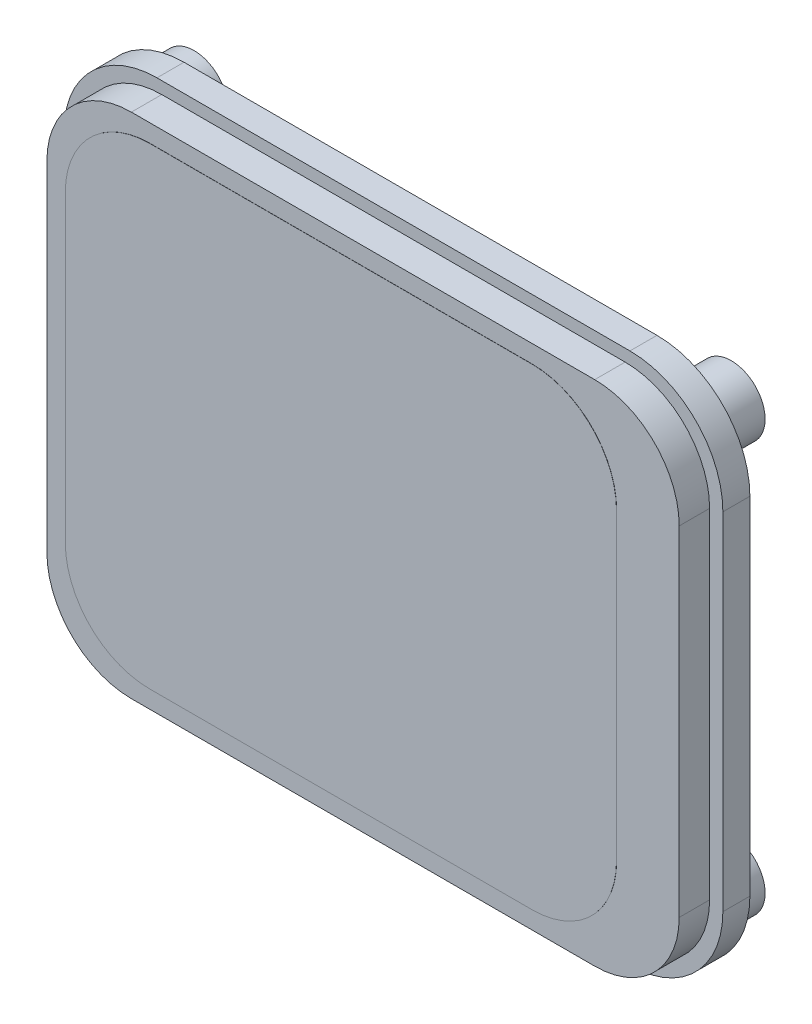
ISO-10303-21;
HEADER;
FILE_DESCRIPTION(('STEP AP214'),'2;1');
FILE_NAME('part.step','',(''),(''),'','','');
FILE_SCHEMA(('AUTOMOTIVE_DESIGN { 1 0 10303 214 1 1 1 1 }'));
ENDSEC;
DATA;
#1=APPLICATION_CONTEXT('core data for automotive mechanical design processes');
#2=APPLICATION_PROTOCOL_DEFINITION('international standard','automotive_design',2000,#1);
#3=PRODUCT_CONTEXT('',#1,'mechanical');
#4=PRODUCT('Part','Part','',(#3));
#5=PRODUCT_RELATED_PRODUCT_CATEGORY('part','',(#4));
#6=PRODUCT_DEFINITION_FORMATION('','',#4);
#7=PRODUCT_DEFINITION_CONTEXT('part definition',#1,'design');
#8=PRODUCT_DEFINITION('design','',#6,#7);
#9=PRODUCT_DEFINITION_SHAPE('','',#8);
#10=(LENGTH_UNIT() NAMED_UNIT(*) SI_UNIT(.MILLI.,.METRE.));
#11=(NAMED_UNIT(*) PLANE_ANGLE_UNIT() SI_UNIT($,.RADIAN.));
#12=(NAMED_UNIT(*) SI_UNIT($,.STERADIAN.) SOLID_ANGLE_UNIT());
#13=UNCERTAINTY_MEASURE_WITH_UNIT(LENGTH_MEASURE(1.E-05),#10,'distance_accuracy_value','');
#14=(GEOMETRIC_REPRESENTATION_CONTEXT(3) GLOBAL_UNCERTAINTY_ASSIGNED_CONTEXT((#13)) GLOBAL_UNIT_ASSIGNED_CONTEXT((#10,
#11,#12)) REPRESENTATION_CONTEXT('',''));
#15=CARTESIAN_POINT('',(0.,0.,0.));
#16=DIRECTION('',(0.,0.,1.));
#17=DIRECTION('',(1.,0.,0.));
#18=AXIS2_PLACEMENT_3D('',#15,#16,#17);
#19=CARTESIAN_POINT('',(11.315,8.985,-0.01));
#20=DIRECTION('',(0.,0.,1.));
#21=DIRECTION('',(1.,0.,0.));
#22=AXIS2_PLACEMENT_3D('',#19,#20,#21);
#23=CYLINDRICAL_SURFACE('',#22,5.);
#24=CARTESIAN_POINT('',(11.315,8.985,0.));
#25=DIRECTION('',(0.,0.,1.));
#26=DIRECTION('',(-1.,0.,0.));
#27=AXIS2_PLACEMENT_3D('',#24,#25,#26);
#28=CIRCLE('',#27,5.);
#29=CARTESIAN_POINT('',(16.315,8.98499999999997,0.));
#30=VERTEX_POINT('',#29);
#31=CARTESIAN_POINT('',(11.315,13.985,0.));
#32=VERTEX_POINT('',#31);
#33=EDGE_CURVE('E260',#30,#32,#28,.T.);
#34=ORIENTED_EDGE('',*,*,#33,.F.);
#35=DIRECTION('',(0.,0.,1.));
#36=VECTOR('',#35,1.);
#37=CARTESIAN_POINT('',(16.315,8.98499999999997,-0.01));
#38=LINE('',#37,#36);
#39=CARTESIAN_POINT('',(16.315,8.98499999999997,-0.01));
#40=VERTEX_POINT('',#39);
#41=EDGE_CURVE('E92',#40,#30,#38,.T.);
#42=ORIENTED_EDGE('',*,*,#41,.F.);
#43=CARTESIAN_POINT('',(11.315,8.985,-0.01));
#44=DIRECTION('',(0.,0.,1.));
#45=DIRECTION('',(-1.,0.,0.));
#46=AXIS2_PLACEMENT_3D('',#43,#44,#45);
#47=CIRCLE('',#46,5.);
#48=CARTESIAN_POINT('',(11.315,13.985,-0.01));
#49=VERTEX_POINT('',#48);
#50=EDGE_CURVE('E107',#40,#49,#47,.T.);
#51=ORIENTED_EDGE('',*,*,#50,.T.);
#52=DIRECTION('',(0.,0.,1.));
#53=VECTOR('',#52,1.);
#54=CARTESIAN_POINT('',(11.315,13.985,-0.01));
#55=LINE('',#54,#53);
#56=EDGE_CURVE('E125',#49,#32,#55,.T.);
#57=ORIENTED_EDGE('',*,*,#56,.T.);
#58=EDGE_LOOP('',(#34,#42,#51,#57));
#59=FACE_BOUND('',#58,.T.);
#60=ADVANCED_FACE('F35',(#59),#23,.T.);
#61=CARTESIAN_POINT('',(16.315,-8.98499999999996,-0.01));
#62=DIRECTION('',(1.,0.,0.));
#63=DIRECTION('',(0.,0.,-1.));
#64=AXIS2_PLACEMENT_3D('',#61,#62,#63);
#65=PLANE('',#64);
#66=DIRECTION('',(0.,1.,0.));
#67=VECTOR('',#66,1.);
#68=CARTESIAN_POINT('',(16.315,-8.98499999999996,0.));
#69=LINE('',#68,#67);
#70=CARTESIAN_POINT('',(16.315,-8.98499999999999,0.));
#71=VERTEX_POINT('',#70);
#72=EDGE_CURVE('E99',#71,#30,#69,.T.);
#73=ORIENTED_EDGE('',*,*,#72,.F.);
#74=DIRECTION('',(0.,0.,1.));
#75=VECTOR('',#74,1.);
#76=CARTESIAN_POINT('',(16.315,-8.98499999999999,-0.01));
#77=LINE('',#76,#75);
#78=CARTESIAN_POINT('',(16.315,-8.98499999999999,-0.01));
#79=VERTEX_POINT('',#78);
#80=EDGE_CURVE('E80',#79,#71,#77,.T.);
#81=ORIENTED_EDGE('',*,*,#80,.F.);
#82=DIRECTION('',(0.,1.,0.));
#83=VECTOR('',#82,1.);
#84=CARTESIAN_POINT('',(16.315,-8.98499999999996,-0.01));
#85=LINE('',#84,#83);
#86=EDGE_CURVE('E127',#79,#40,#85,.T.);
#87=ORIENTED_EDGE('',*,*,#86,.T.);
#88=ORIENTED_EDGE('',*,*,#41,.T.);
#89=EDGE_LOOP('',(#73,#81,#87,#88));
#90=FACE_BOUND('',#89,.T.);
#91=ADVANCED_FACE('F104',(#90),#65,.T.);
#92=CARTESIAN_POINT('',(11.315,-8.98499999999999,-0.01));
#93=DIRECTION('',(0.,0.,1.));
#94=DIRECTION('',(1.,0.,0.));
#95=AXIS2_PLACEMENT_3D('',#92,#93,#94);
#96=CYLINDRICAL_SURFACE('',#95,5.);
#97=CARTESIAN_POINT('',(11.315,-8.98499999999999,0.));
#98=DIRECTION('',(0.,0.,1.));
#99=DIRECTION('',(1.,0.,0.));
#100=AXIS2_PLACEMENT_3D('',#97,#98,#99);
#101=CIRCLE('',#100,5.);
#102=CARTESIAN_POINT('',(11.315,-13.985,0.));
#103=VERTEX_POINT('',#102);
#104=EDGE_CURVE('E84',#103,#71,#101,.T.);
#105=ORIENTED_EDGE('',*,*,#104,.F.);
#106=DIRECTION('',(0.,0.,1.));
#107=VECTOR('',#106,1.);
#108=CARTESIAN_POINT('',(11.315,-13.985,-0.01));
#109=LINE('',#108,#107);
#110=CARTESIAN_POINT('',(11.315,-13.985,-0.01));
#111=VERTEX_POINT('',#110);
#112=EDGE_CURVE('E93',#111,#103,#109,.T.);
#113=ORIENTED_EDGE('',*,*,#112,.F.);
#114=CARTESIAN_POINT('',(11.315,-8.98499999999999,-0.01));
#115=DIRECTION('',(0.,0.,1.));
#116=DIRECTION('',(1.,0.,0.));
#117=AXIS2_PLACEMENT_3D('',#114,#115,#116);
#118=CIRCLE('',#117,5.);
#119=EDGE_CURVE('E88',#111,#79,#118,.T.);
#120=ORIENTED_EDGE('',*,*,#119,.T.);
#121=ORIENTED_EDGE('',*,*,#80,.T.);
#122=EDGE_LOOP('',(#105,#113,#120,#121));
#123=FACE_BOUND('',#122,.T.);
#124=ADVANCED_FACE('F82',(#123),#96,.T.);
#125=CARTESIAN_POINT('',(-11.315,-13.985,-0.01));
#126=DIRECTION('',(0.,-1.,0.));
#127=DIRECTION('',(0.,0.,-1.));
#128=AXIS2_PLACEMENT_3D('',#125,#126,#127);
#129=PLANE('',#128);
#130=DIRECTION('',(1.,0.,0.));
#131=VECTOR('',#130,1.);
#132=CARTESIAN_POINT('',(-11.315,-13.985,0.));
#133=LINE('',#132,#131);
#134=CARTESIAN_POINT('',(-11.315,-13.985,0.));
#135=VERTEX_POINT('',#134);
#136=EDGE_CURVE('E102',#135,#103,#133,.T.);
#137=ORIENTED_EDGE('',*,*,#136,.F.);
#138=DIRECTION('',(0.,0.,1.));
#139=VECTOR('',#138,1.);
#140=CARTESIAN_POINT('',(-11.315,-13.985,-0.01));
#141=LINE('',#140,#139);
#142=CARTESIAN_POINT('',(-11.315,-13.985,-0.01));
#143=VERTEX_POINT('',#142);
#144=EDGE_CURVE('E117',#143,#135,#141,.T.);
#145=ORIENTED_EDGE('',*,*,#144,.F.);
#146=DIRECTION('',(1.,0.,0.));
#147=VECTOR('',#146,1.);
#148=CARTESIAN_POINT('',(-11.315,-13.985,-0.01));
#149=LINE('',#148,#147);
#150=EDGE_CURVE('E271',#143,#111,#149,.T.);
#151=ORIENTED_EDGE('',*,*,#150,.T.);
#152=ORIENTED_EDGE('',*,*,#112,.T.);
#153=EDGE_LOOP('',(#137,#145,#151,#152));
#154=FACE_BOUND('',#153,.T.);
#155=ADVANCED_FACE('F297',(#154),#129,.T.);
#156=CARTESIAN_POINT('',(-11.315,-8.98499999999999,-0.01));
#157=DIRECTION('',(0.,0.,1.));
#158=DIRECTION('',(1.,0.,0.));
#159=AXIS2_PLACEMENT_3D('',#156,#157,#158);
#160=CYLINDRICAL_SURFACE('',#159,5.);
#161=CARTESIAN_POINT('',(-11.315,-8.98499999999999,0.));
#162=DIRECTION('',(0.,0.,1.));
#163=DIRECTION('',(-1.,0.,0.));
#164=AXIS2_PLACEMENT_3D('',#161,#162,#163);
#165=CIRCLE('',#164,5.);
#166=CARTESIAN_POINT('',(-16.315,-8.98499999999996,0.));
#167=VERTEX_POINT('',#166);
#168=EDGE_CURVE('E286',#167,#135,#165,.T.);
#169=ORIENTED_EDGE('',*,*,#168,.F.);
#170=DIRECTION('',(0.,0.,1.));
#171=VECTOR('',#170,1.);
#172=CARTESIAN_POINT('',(-16.315,-8.98499999999996,-0.01));
#173=LINE('',#172,#171);
#174=CARTESIAN_POINT('',(-16.315,-8.98499999999996,-0.01));
#175=VERTEX_POINT('',#174);
#176=EDGE_CURVE('E119',#175,#167,#173,.T.);
#177=ORIENTED_EDGE('',*,*,#176,.F.);
#178=CARTESIAN_POINT('',(-11.315,-8.98499999999999,-0.01));
#179=DIRECTION('',(0.,0.,1.));
#180=DIRECTION('',(-1.,0.,0.));
#181=AXIS2_PLACEMENT_3D('',#178,#179,#180);
#182=CIRCLE('',#181,5.);
#183=EDGE_CURVE('E268',#175,#143,#182,.T.);
#184=ORIENTED_EDGE('',*,*,#183,.T.);
#185=ORIENTED_EDGE('',*,*,#144,.T.);
#186=EDGE_LOOP('',(#169,#177,#184,#185));
#187=FACE_BOUND('',#186,.T.);
#188=ADVANCED_FACE('F291',(#187),#160,.T.);
#189=CARTESIAN_POINT('',(-16.315,-8.98499999999996,-0.01));
#190=DIRECTION('',(-1.,0.,0.));
#191=DIRECTION('',(0.,0.,1.));
#192=AXIS2_PLACEMENT_3D('',#189,#190,#191);
#193=PLANE('',#192);
#194=DIRECTION('',(0.,-1.,0.));
#195=VECTOR('',#194,1.);
#196=CARTESIAN_POINT('',(-16.315,-8.98499999999996,0.));
#197=LINE('',#196,#195);
#198=CARTESIAN_POINT('',(-16.315,8.98499999999997,0.));
#199=VERTEX_POINT('',#198);
#200=EDGE_CURVE('E283',#199,#167,#197,.T.);
#201=ORIENTED_EDGE('',*,*,#200,.F.);
#202=DIRECTION('',(0.,0.,1.));
#203=VECTOR('',#202,1.);
#204=CARTESIAN_POINT('',(-16.315,8.98499999999997,-0.01));
#205=LINE('',#204,#203);
#206=CARTESIAN_POINT('',(-16.315,8.98499999999997,-0.01));
#207=VERTEX_POINT('',#206);
#208=EDGE_CURVE('E121',#207,#199,#205,.T.);
#209=ORIENTED_EDGE('',*,*,#208,.F.);
#210=DIRECTION('',(0.,-1.,0.));
#211=VECTOR('',#210,1.);
#212=CARTESIAN_POINT('',(-16.315,-8.98499999999996,-0.01));
#213=LINE('',#212,#211);
#214=EDGE_CURVE('E265',#207,#175,#213,.T.);
#215=ORIENTED_EDGE('',*,*,#214,.T.);
#216=ORIENTED_EDGE('',*,*,#176,.T.);
#217=EDGE_LOOP('',(#201,#209,#215,#216));
#218=FACE_BOUND('',#217,.T.);
#219=ADVANCED_FACE('F527',(#218),#193,.T.);
#220=CARTESIAN_POINT('',(-11.315,8.985,-0.01));
#221=DIRECTION('',(0.,0.,1.));
#222=DIRECTION('',(1.,0.,0.));
#223=AXIS2_PLACEMENT_3D('',#220,#221,#222);
#224=CYLINDRICAL_SURFACE('',#223,5.);
#225=CARTESIAN_POINT('',(-11.315,8.985,0.));
#226=DIRECTION('',(0.,0.,1.));
#227=DIRECTION('',(-1.,0.,0.));
#228=AXIS2_PLACEMENT_3D('',#225,#226,#227);
#229=CIRCLE('',#228,5.);
#230=CARTESIAN_POINT('',(-11.315,13.985,0.));
#231=VERTEX_POINT('',#230);
#232=EDGE_CURVE('E280',#231,#199,#229,.T.);
#233=ORIENTED_EDGE('',*,*,#232,.F.);
#234=DIRECTION('',(0.,0.,1.));
#235=VECTOR('',#234,1.);
#236=CARTESIAN_POINT('',(-11.315,13.985,-0.01));
#237=LINE('',#236,#235);
#238=CARTESIAN_POINT('',(-11.315,13.985,-0.01));
#239=VERTEX_POINT('',#238);
#240=EDGE_CURVE('E123',#239,#231,#237,.T.);
#241=ORIENTED_EDGE('',*,*,#240,.F.);
#242=CARTESIAN_POINT('',(-11.315,8.985,-0.01));
#243=DIRECTION('',(0.,0.,1.));
#244=DIRECTION('',(-1.,0.,0.));
#245=AXIS2_PLACEMENT_3D('',#242,#243,#244);
#246=CIRCLE('',#245,5.);
#247=EDGE_CURVE('E50',#239,#207,#246,.T.);
#248=ORIENTED_EDGE('',*,*,#247,.T.);
#249=ORIENTED_EDGE('',*,*,#208,.T.);
#250=EDGE_LOOP('',(#233,#241,#248,#249));
#251=FACE_BOUND('',#250,.T.);
#252=ADVANCED_FACE('F524',(#251),#224,.T.);
#253=CARTESIAN_POINT('',(-11.315,13.985,-0.01));
#254=DIRECTION('',(0.,1.,0.));
#255=DIRECTION('',(0.,0.,1.));
#256=AXIS2_PLACEMENT_3D('',#253,#254,#255);
#257=PLANE('',#256);
#258=DIRECTION('',(-1.,0.,0.));
#259=VECTOR('',#258,1.);
#260=CARTESIAN_POINT('',(-11.315,13.985,0.));
#261=LINE('',#260,#259);
#262=EDGE_CURVE('E277',#32,#231,#261,.T.);
#263=ORIENTED_EDGE('',*,*,#262,.F.);
#264=ORIENTED_EDGE('',*,*,#56,.F.);
#265=DIRECTION('',(-1.,0.,0.));
#266=VECTOR('',#265,1.);
#267=CARTESIAN_POINT('',(-11.315,13.985,-0.01));
#268=LINE('',#267,#266);
#269=EDGE_CURVE('E110',#49,#239,#268,.T.);
#270=ORIENTED_EDGE('',*,*,#269,.T.);
#271=ORIENTED_EDGE('',*,*,#240,.T.);
#272=EDGE_LOOP('',(#263,#264,#270,#271));
#273=FACE_BOUND('',#272,.T.);
#274=ADVANCED_FACE('F522',(#273),#257,.T.);
#275=CARTESIAN_POINT('',(11.315,8.985,0.));
#276=DIRECTION('',(0.,0.,-1.));
#277=DIRECTION('',(-1.,0.,0.));
#278=AXIS2_PLACEMENT_3D('',#275,#276,#277);
#279=PLANE('',#278);
#280=ORIENTED_EDGE('',*,*,#33,.T.);
#281=ORIENTED_EDGE('',*,*,#262,.T.);
#282=ORIENTED_EDGE('',*,*,#232,.T.);
#283=ORIENTED_EDGE('',*,*,#200,.T.);
#284=ORIENTED_EDGE('',*,*,#168,.T.);
#285=ORIENTED_EDGE('',*,*,#136,.T.);
#286=ORIENTED_EDGE('',*,*,#104,.T.);
#287=ORIENTED_EDGE('',*,*,#72,.T.);
#288=EDGE_LOOP('',(#280,#281,#282,#283,#284,#285,#286,#287));
#289=FACE_BOUND('',#288,.T.);
#290=ADVANCED_FACE('F98',(#289),#279,.F.);
#291=CARTESIAN_POINT('',(-12.415,-10.035,-1.81));
#292=DIRECTION('',(0.,0.,1.));
#293=DIRECTION('',(1.,0.,0.));
#294=AXIS2_PLACEMENT_3D('',#291,#292,#293);
#295=CYLINDRICAL_SURFACE('',#294,5.);
#296=CARTESIAN_POINT('',(-12.415,-10.035,-0.01));
#297=DIRECTION('',(0.,0.,-1.));
#298=DIRECTION('',(-1.,0.,0.));
#299=AXIS2_PLACEMENT_3D('',#296,#297,#298);
#300=CIRCLE('',#299,5.);
#301=CARTESIAN_POINT('',(-12.415,-15.035,-0.01));
#302=VERTEX_POINT('',#301);
#303=CARTESIAN_POINT('',(-17.415,-10.035,-0.01));
#304=VERTEX_POINT('',#303);
#305=EDGE_CURVE('E182',#302,#304,#300,.T.);
#306=ORIENTED_EDGE('',*,*,#305,.T.);
#307=DIRECTION('',(0.,0.,1.));
#308=VECTOR('',#307,1.);
#309=CARTESIAN_POINT('',(-17.415,-10.035,-1.81));
#310=LINE('',#309,#308);
#311=CARTESIAN_POINT('',(-17.415,-10.035,-1.81));
#312=VERTEX_POINT('',#311);
#313=EDGE_CURVE('E258',#312,#304,#310,.T.);
#314=ORIENTED_EDGE('',*,*,#313,.F.);
#315=CARTESIAN_POINT('',(-12.415,-10.035,-1.81));
#316=DIRECTION('',(0.,0.,-1.));
#317=DIRECTION('',(-1.,0.,0.));
#318=AXIS2_PLACEMENT_3D('',#315,#316,#317);
#319=CIRCLE('',#318,5.);
#320=CARTESIAN_POINT('',(-12.415,-15.035,-1.81));
#321=VERTEX_POINT('',#320);
#322=EDGE_CURVE('E193',#321,#312,#319,.T.);
#323=ORIENTED_EDGE('',*,*,#322,.F.);
#324=DIRECTION('',(0.,0.,1.));
#325=VECTOR('',#324,1.);
#326=CARTESIAN_POINT('',(-12.415,-15.035,-1.81));
#327=LINE('',#326,#325);
#328=EDGE_CURVE('E217',#321,#302,#327,.T.);
#329=ORIENTED_EDGE('',*,*,#328,.T.);
#330=EDGE_LOOP('',(#306,#314,#323,#329));
#331=FACE_BOUND('',#330,.T.);
#332=ADVANCED_FACE('F540',(#331),#295,.T.);
#333=CARTESIAN_POINT('',(-17.415,-10.035,-1.81));
#334=DIRECTION('',(1.,0.,0.));
#335=DIRECTION('',(0.,0.,-1.));
#336=AXIS2_PLACEMENT_3D('',#333,#334,#335);
#337=PLANE('',#336);
#338=DIRECTION('',(0.,1.,0.));
#339=VECTOR('',#338,1.);
#340=CARTESIAN_POINT('',(-17.415,-10.035,-0.01));
#341=LINE('',#340,#339);
#342=CARTESIAN_POINT('',(-17.415,10.035,-0.01));
#343=VERTEX_POINT('',#342);
#344=EDGE_CURVE('E186',#304,#343,#341,.T.);
#345=ORIENTED_EDGE('',*,*,#344,.T.);
#346=DIRECTION('',(0.,0.,1.));
#347=VECTOR('',#346,1.);
#348=CARTESIAN_POINT('',(-17.415,10.035,-1.81));
#349=LINE('',#348,#347);
#350=CARTESIAN_POINT('',(-17.415,10.035,-1.81));
#351=VERTEX_POINT('',#350);
#352=EDGE_CURVE('E255',#351,#343,#349,.T.);
#353=ORIENTED_EDGE('',*,*,#352,.F.);
#354=DIRECTION('',(0.,1.,0.));
#355=VECTOR('',#354,1.);
#356=CARTESIAN_POINT('',(-17.415,-10.035,-1.81));
#357=LINE('',#356,#355);
#358=EDGE_CURVE('E196',#312,#351,#357,.T.);
#359=ORIENTED_EDGE('',*,*,#358,.F.);
#360=ORIENTED_EDGE('',*,*,#313,.T.);
#361=EDGE_LOOP('',(#345,#353,#359,#360));
#362=FACE_BOUND('',#361,.T.);
#363=ADVANCED_FACE('F564',(#362),#337,.F.);
#364=CARTESIAN_POINT('',(-12.415,10.035,-1.81));
#365=DIRECTION('',(0.,0.,1.));
#366=DIRECTION('',(1.,0.,0.));
#367=AXIS2_PLACEMENT_3D('',#364,#365,#366);
#368=CYLINDRICAL_SURFACE('',#367,5.);
#369=CARTESIAN_POINT('',(-12.415,10.035,-0.01));
#370=DIRECTION('',(0.,0.,-1.));
#371=DIRECTION('',(1.,0.,0.));
#372=AXIS2_PLACEMENT_3D('',#369,#370,#371);
#373=CIRCLE('',#372,5.);
#374=CARTESIAN_POINT('',(-12.415,15.035,-0.01));
#375=VERTEX_POINT('',#374);
#376=EDGE_CURVE('E221',#343,#375,#373,.T.);
#377=ORIENTED_EDGE('',*,*,#376,.T.);
#378=DIRECTION('',(0.,0.,1.));
#379=VECTOR('',#378,1.);
#380=CARTESIAN_POINT('',(-12.415,15.035,-1.81));
#381=LINE('',#380,#379);
#382=CARTESIAN_POINT('',(-12.415,15.035,-1.81));
#383=VERTEX_POINT('',#382);
#384=EDGE_CURVE('E252',#383,#375,#381,.T.);
#385=ORIENTED_EDGE('',*,*,#384,.F.);
#386=CARTESIAN_POINT('',(-12.415,10.035,-1.81));
#387=DIRECTION('',(0.,0.,-1.));
#388=DIRECTION('',(1.,0.,0.));
#389=AXIS2_PLACEMENT_3D('',#386,#387,#388);
#390=CIRCLE('',#389,5.);
#391=EDGE_CURVE('E200',#351,#383,#390,.T.);
#392=ORIENTED_EDGE('',*,*,#391,.F.);
#393=ORIENTED_EDGE('',*,*,#352,.T.);
#394=EDGE_LOOP('',(#377,#385,#392,#393));
#395=FACE_BOUND('',#394,.T.);
#396=ADVANCED_FACE('F561',(#395),#368,.T.);
#397=CARTESIAN_POINT('',(15.015,15.035,-1.81));
#398=DIRECTION('',(0.,-1.,0.));
#399=DIRECTION('',(0.,0.,-1.));
#400=AXIS2_PLACEMENT_3D('',#397,#398,#399);
#401=PLANE('',#400);
#402=DIRECTION('',(1.,0.,0.));
#403=VECTOR('',#402,1.);
#404=CARTESIAN_POINT('',(15.015,15.035,-0.01));
#405=LINE('',#404,#403);
#406=CARTESIAN_POINT('',(15.015,15.035,-0.01));
#407=VERTEX_POINT('',#406);
#408=EDGE_CURVE('E224',#375,#407,#405,.T.);
#409=ORIENTED_EDGE('',*,*,#408,.T.);
#410=DIRECTION('',(0.,0.,1.));
#411=VECTOR('',#410,1.);
#412=CARTESIAN_POINT('',(15.015,15.035,-1.81));
#413=LINE('',#412,#411);
#414=CARTESIAN_POINT('',(15.015,15.035,-1.81));
#415=VERTEX_POINT('',#414);
#416=EDGE_CURVE('E249',#415,#407,#413,.T.);
#417=ORIENTED_EDGE('',*,*,#416,.F.);
#418=DIRECTION('',(1.,0.,0.));
#419=VECTOR('',#418,1.);
#420=CARTESIAN_POINT('',(15.015,15.035,-1.81));
#421=LINE('',#420,#419);
#422=EDGE_CURVE('E203',#383,#415,#421,.T.);
#423=ORIENTED_EDGE('',*,*,#422,.F.);
#424=ORIENTED_EDGE('',*,*,#384,.T.);
#425=EDGE_LOOP('',(#409,#417,#423,#424));
#426=FACE_BOUND('',#425,.T.);
#427=ADVANCED_FACE('F559',(#426),#401,.F.);
#428=CARTESIAN_POINT('',(15.015,10.035,-1.81));
#429=DIRECTION('',(0.,0.,1.));
#430=DIRECTION('',(1.,0.,0.));
#431=AXIS2_PLACEMENT_3D('',#428,#429,#430);
#432=CYLINDRICAL_SURFACE('',#431,5.);
#433=CARTESIAN_POINT('',(15.015,10.035,-0.01));
#434=DIRECTION('',(0.,0.,-1.));
#435=DIRECTION('',(1.,0.,0.));
#436=AXIS2_PLACEMENT_3D('',#433,#434,#435);
#437=CIRCLE('',#436,5.);
#438=CARTESIAN_POINT('',(20.015,10.035,-0.01));
#439=VERTEX_POINT('',#438);
#440=EDGE_CURVE('E227',#407,#439,#437,.T.);
#441=ORIENTED_EDGE('',*,*,#440,.T.);
#442=DIRECTION('',(0.,0.,1.));
#443=VECTOR('',#442,1.);
#444=CARTESIAN_POINT('',(20.015,10.035,-1.81));
#445=LINE('',#444,#443);
#446=CARTESIAN_POINT('',(20.015,10.035,-1.81));
#447=VERTEX_POINT('',#446);
#448=EDGE_CURVE('E246',#447,#439,#445,.T.);
#449=ORIENTED_EDGE('',*,*,#448,.F.);
#450=CARTESIAN_POINT('',(15.015,10.035,-1.81));
#451=DIRECTION('',(0.,0.,-1.));
#452=DIRECTION('',(1.,0.,0.));
#453=AXIS2_PLACEMENT_3D('',#450,#451,#452);
#454=CIRCLE('',#453,5.);
#455=EDGE_CURVE('E206',#415,#447,#454,.T.);
#456=ORIENTED_EDGE('',*,*,#455,.F.);
#457=ORIENTED_EDGE('',*,*,#416,.T.);
#458=EDGE_LOOP('',(#441,#449,#456,#457));
#459=FACE_BOUND('',#458,.T.);
#460=ADVANCED_FACE('F556',(#459),#432,.T.);
#461=CARTESIAN_POINT('',(20.015,-10.035,-1.81));
#462=DIRECTION('',(-1.,0.,0.));
#463=DIRECTION('',(0.,0.,1.));
#464=AXIS2_PLACEMENT_3D('',#461,#462,#463);
#465=PLANE('',#464);
#466=DIRECTION('',(0.,-1.,0.));
#467=VECTOR('',#466,1.);
#468=CARTESIAN_POINT('',(20.015,-10.035,-0.01));
#469=LINE('',#468,#467);
#470=CARTESIAN_POINT('',(20.015,-10.035,-0.01));
#471=VERTEX_POINT('',#470);
#472=EDGE_CURVE('E230',#439,#471,#469,.T.);
#473=ORIENTED_EDGE('',*,*,#472,.T.);
#474=DIRECTION('',(0.,0.,1.));
#475=VECTOR('',#474,1.);
#476=CARTESIAN_POINT('',(20.015,-10.035,-1.81));
#477=LINE('',#476,#475);
#478=CARTESIAN_POINT('',(20.015,-10.035,-1.81));
#479=VERTEX_POINT('',#478);
#480=EDGE_CURVE('E243',#479,#471,#477,.T.);
#481=ORIENTED_EDGE('',*,*,#480,.F.);
#482=DIRECTION('',(0.,-1.,0.));
#483=VECTOR('',#482,1.);
#484=CARTESIAN_POINT('',(20.015,-10.035,-1.81));
#485=LINE('',#484,#483);
#486=EDGE_CURVE('E209',#447,#479,#485,.T.);
#487=ORIENTED_EDGE('',*,*,#486,.F.);
#488=ORIENTED_EDGE('',*,*,#448,.T.);
#489=EDGE_LOOP('',(#473,#481,#487,#488));
#490=FACE_BOUND('',#489,.T.);
#491=ADVANCED_FACE('F553',(#490),#465,.F.);
#492=CARTESIAN_POINT('',(15.015,-10.035,-1.81));
#493=DIRECTION('',(0.,0.,1.));
#494=DIRECTION('',(1.,0.,0.));
#495=AXIS2_PLACEMENT_3D('',#492,#493,#494);
#496=CYLINDRICAL_SURFACE('',#495,5.);
#497=CARTESIAN_POINT('',(15.015,-10.035,-0.01));
#498=DIRECTION('',(0.,0.,-1.));
#499=DIRECTION('',(1.,0.,0.));
#500=AXIS2_PLACEMENT_3D('',#497,#498,#499);
#501=CIRCLE('',#500,5.);
#502=CARTESIAN_POINT('',(15.015,-15.035,-0.01));
#503=VERTEX_POINT('',#502);
#504=EDGE_CURVE('E233',#471,#503,#501,.T.);
#505=ORIENTED_EDGE('',*,*,#504,.T.);
#506=DIRECTION('',(0.,0.,1.));
#507=VECTOR('',#506,1.);
#508=CARTESIAN_POINT('',(15.015,-15.035,-1.81));
#509=LINE('',#508,#507);
#510=CARTESIAN_POINT('',(15.015,-15.035,-1.81));
#511=VERTEX_POINT('',#510);
#512=EDGE_CURVE('E240',#511,#503,#509,.T.);
#513=ORIENTED_EDGE('',*,*,#512,.F.);
#514=CARTESIAN_POINT('',(15.015,-10.035,-1.81));
#515=DIRECTION('',(0.,0.,-1.));
#516=DIRECTION('',(1.,0.,0.));
#517=AXIS2_PLACEMENT_3D('',#514,#515,#516);
#518=CIRCLE('',#517,5.);
#519=EDGE_CURVE('E212',#479,#511,#518,.T.);
#520=ORIENTED_EDGE('',*,*,#519,.F.);
#521=ORIENTED_EDGE('',*,*,#480,.T.);
#522=EDGE_LOOP('',(#505,#513,#520,#521));
#523=FACE_BOUND('',#522,.T.);
#524=ADVANCED_FACE('F548',(#523),#496,.T.);
#525=CARTESIAN_POINT('',(15.015,-15.035,-1.81));
#526=DIRECTION('',(0.,1.,0.));
#527=DIRECTION('',(0.,0.,1.));
#528=AXIS2_PLACEMENT_3D('',#525,#526,#527);
#529=PLANE('',#528);
#530=DIRECTION('',(-1.,0.,0.));
#531=VECTOR('',#530,1.);
#532=CARTESIAN_POINT('',(15.015,-15.035,-0.01));
#533=LINE('',#532,#531);
#534=EDGE_CURVE('E197',#503,#302,#533,.T.);
#535=ORIENTED_EDGE('',*,*,#534,.T.);
#536=ORIENTED_EDGE('',*,*,#328,.F.);
#537=DIRECTION('',(-1.,0.,0.));
#538=VECTOR('',#537,1.);
#539=CARTESIAN_POINT('',(15.015,-15.035,-1.81));
#540=LINE('',#539,#538);
#541=EDGE_CURVE('E215',#511,#321,#540,.T.);
#542=ORIENTED_EDGE('',*,*,#541,.F.);
#543=ORIENTED_EDGE('',*,*,#512,.T.);
#544=EDGE_LOOP('',(#535,#536,#542,#543));
#545=FACE_BOUND('',#544,.T.);
#546=ADVANCED_FACE('F532',(#545),#529,.F.);
#547=CARTESIAN_POINT('',(-12.415,-10.035,-0.01));
#548=DIRECTION('',(0.,0.,-1.));
#549=DIRECTION('',(-1.,0.,0.));
#550=AXIS2_PLACEMENT_3D('',#547,#548,#549);
#551=PLANE('',#550);
#552=ORIENTED_EDGE('',*,*,#50,.F.);
#553=ORIENTED_EDGE('',*,*,#86,.F.);
#554=ORIENTED_EDGE('',*,*,#119,.F.);
#555=ORIENTED_EDGE('',*,*,#150,.F.);
#556=ORIENTED_EDGE('',*,*,#183,.F.);
#557=ORIENTED_EDGE('',*,*,#214,.F.);
#558=ORIENTED_EDGE('',*,*,#247,.F.);
#559=ORIENTED_EDGE('',*,*,#269,.F.);
#560=EDGE_LOOP('',(#552,#553,#554,#555,#556,#557,#558,#559));
#561=FACE_BOUND('',#560,.T.);
#562=ORIENTED_EDGE('',*,*,#305,.F.);
#563=ORIENTED_EDGE('',*,*,#534,.F.);
#564=ORIENTED_EDGE('',*,*,#504,.F.);
#565=ORIENTED_EDGE('',*,*,#472,.F.);
#566=ORIENTED_EDGE('',*,*,#440,.F.);
#567=ORIENTED_EDGE('',*,*,#408,.F.);
#568=ORIENTED_EDGE('',*,*,#376,.F.);
#569=ORIENTED_EDGE('',*,*,#344,.F.);
#570=EDGE_LOOP('',(#562,#563,#564,#565,#566,#567,#568,#569));
#571=FACE_BOUND('',#570,.T.);
#572=ADVANCED_FACE('F529',(#561,#571),#551,.F.);
#573=CARTESIAN_POINT('',(-12.7,10.25,-3.41));
#574=DIRECTION('',(0.,0.,1.));
#575=DIRECTION('',(1.,0.,0.));
#576=AXIS2_PLACEMENT_3D('',#573,#574,#575);
#577=CYLINDRICAL_SURFACE('',#576,5.5);
#578=CARTESIAN_POINT('',(-12.7,10.25,-1.81));
#579=DIRECTION('',(0.,0.,-1.));
#580=DIRECTION('',(1.,0.,0.));
#581=AXIS2_PLACEMENT_3D('',#578,#579,#580);
#582=CIRCLE('',#581,5.5);
#583=CARTESIAN_POINT('',(-18.2,10.25,-1.81));
#584=VERTEX_POINT('',#583);
#585=CARTESIAN_POINT('',(-12.7,15.75,-1.81));
#586=VERTEX_POINT('',#585);
#587=EDGE_CURVE('E179',#584,#586,#582,.T.);
#588=ORIENTED_EDGE('',*,*,#587,.T.);
#589=DIRECTION('',(0.,0.,1.));
#590=VECTOR('',#589,1.);
#591=CARTESIAN_POINT('',(-12.7,15.75,-3.41));
#592=LINE('',#591,#590);
#593=CARTESIAN_POINT('',(-12.7,15.75,-3.41));
#594=VERTEX_POINT('',#593);
#595=EDGE_CURVE('E175',#594,#586,#592,.T.);
#596=ORIENTED_EDGE('',*,*,#595,.F.);
#597=CARTESIAN_POINT('',(-12.7,10.25,-3.41));
#598=DIRECTION('',(0.,0.,-1.));
#599=DIRECTION('',(1.,0.,0.));
#600=AXIS2_PLACEMENT_3D('',#597,#598,#599);
#601=CIRCLE('',#600,5.5);
#602=CARTESIAN_POINT('',(-18.2,10.25,-3.41));
#603=VERTEX_POINT('',#602);
#604=EDGE_CURVE('E155',#603,#594,#601,.T.);
#605=ORIENTED_EDGE('',*,*,#604,.F.);
#606=DIRECTION('',(0.,0.,1.));
#607=VECTOR('',#606,1.);
#608=CARTESIAN_POINT('',(-18.2,10.25,-3.41));
#609=LINE('',#608,#607);
#610=EDGE_CURVE('E413',#603,#584,#609,.T.);
#611=ORIENTED_EDGE('',*,*,#610,.T.);
#612=EDGE_LOOP('',(#588,#596,#605,#611));
#613=FACE_BOUND('',#612,.T.);
#614=ADVANCED_FACE('F176',(#613),#577,.T.);
#615=CARTESIAN_POINT('',(15.3,15.75,-3.41));
#616=DIRECTION('',(0.,-1.,0.));
#617=DIRECTION('',(0.,0.,-1.));
#618=AXIS2_PLACEMENT_3D('',#615,#616,#617);
#619=PLANE('',#618);
#620=DIRECTION('',(1.,0.,0.));
#621=VECTOR('',#620,1.);
#622=CARTESIAN_POINT('',(15.3,15.75,-1.81));
#623=LINE('',#622,#621);
#624=CARTESIAN_POINT('',(15.3,15.75,-1.81));
#625=VERTEX_POINT('',#624);
#626=EDGE_CURVE('E415',#586,#625,#623,.T.);
#627=ORIENTED_EDGE('',*,*,#626,.T.);
#628=DIRECTION('',(0.,0.,1.));
#629=VECTOR('',#628,1.);
#630=CARTESIAN_POINT('',(15.3,15.75,-3.41));
#631=LINE('',#630,#629);
#632=CARTESIAN_POINT('',(15.3,15.75,-3.41));
#633=VERTEX_POINT('',#632);
#634=EDGE_CURVE('E183',#633,#625,#631,.T.);
#635=ORIENTED_EDGE('',*,*,#634,.F.);
#636=DIRECTION('',(1.,0.,0.));
#637=VECTOR('',#636,1.);
#638=CARTESIAN_POINT('',(15.3,15.75,-3.41));
#639=LINE('',#638,#637);
#640=EDGE_CURVE('E160',#594,#633,#639,.T.);
#641=ORIENTED_EDGE('',*,*,#640,.F.);
#642=ORIENTED_EDGE('',*,*,#595,.T.);
#643=EDGE_LOOP('',(#627,#635,#641,#642));
#644=FACE_BOUND('',#643,.T.);
#645=ADVANCED_FACE('F455',(#644),#619,.F.);
#646=CARTESIAN_POINT('',(15.3,10.25,-3.41));
#647=DIRECTION('',(0.,0.,1.));
#648=DIRECTION('',(1.,0.,0.));
#649=AXIS2_PLACEMENT_3D('',#646,#647,#648);
#650=CYLINDRICAL_SURFACE('',#649,5.5);
#651=CARTESIAN_POINT('',(15.3,10.25,-1.81));
#652=DIRECTION('',(0.,0.,-1.));
#653=DIRECTION('',(1.,0.,0.));
#654=AXIS2_PLACEMENT_3D('',#651,#652,#653);
#655=CIRCLE('',#654,5.5);
#656=CARTESIAN_POINT('',(20.8,10.25,-1.81));
#657=VERTEX_POINT('',#656);
#658=EDGE_CURVE('E396',#625,#657,#655,.T.);
#659=ORIENTED_EDGE('',*,*,#658,.T.);
#660=DIRECTION('',(0.,0.,1.));
#661=VECTOR('',#660,1.);
#662=CARTESIAN_POINT('',(20.8,10.25,-3.41));
#663=LINE('',#662,#661);
#664=CARTESIAN_POINT('',(20.8,10.25,-3.41));
#665=VERTEX_POINT('',#664);
#666=EDGE_CURVE('E189',#665,#657,#663,.T.);
#667=ORIENTED_EDGE('',*,*,#666,.F.);
#668=CARTESIAN_POINT('',(15.3,10.25,-3.41));
#669=DIRECTION('',(0.,0.,-1.));
#670=DIRECTION('',(1.,0.,0.));
#671=AXIS2_PLACEMENT_3D('',#668,#669,#670);
#672=CIRCLE('',#671,5.5);
#673=EDGE_CURVE('E386',#633,#665,#672,.T.);
#674=ORIENTED_EDGE('',*,*,#673,.F.);
#675=ORIENTED_EDGE('',*,*,#634,.T.);
#676=EDGE_LOOP('',(#659,#667,#674,#675));
#677=FACE_BOUND('',#676,.T.);
#678=ADVANCED_FACE('F394',(#677),#650,.T.);
#679=CARTESIAN_POINT('',(20.8,-10.25,-3.41));
#680=DIRECTION('',(-1.,0.,0.));
#681=DIRECTION('',(0.,0.,1.));
#682=AXIS2_PLACEMENT_3D('',#679,#680,#681);
#683=PLANE('',#682);
#684=DIRECTION('',(0.,-1.,0.));
#685=VECTOR('',#684,1.);
#686=CARTESIAN_POINT('',(20.8,-10.25,-1.81));
#687=LINE('',#686,#685);
#688=CARTESIAN_POINT('',(20.8,-10.25,-1.81));
#689=VERTEX_POINT('',#688);
#690=EDGE_CURVE('E419',#657,#689,#687,.T.);
#691=ORIENTED_EDGE('',*,*,#690,.T.);
#692=DIRECTION('',(0.,0.,1.));
#693=VECTOR('',#692,1.);
#694=CARTESIAN_POINT('',(20.8,-10.25,-3.41));
#695=LINE('',#694,#693);
#696=CARTESIAN_POINT('',(20.8,-10.25,-3.41));
#697=VERTEX_POINT('',#696);
#698=EDGE_CURVE('E399',#697,#689,#695,.T.);
#699=ORIENTED_EDGE('',*,*,#698,.F.);
#700=DIRECTION('',(0.,-1.,0.));
#701=VECTOR('',#700,1.);
#702=CARTESIAN_POINT('',(20.8,-10.25,-3.41));
#703=LINE('',#702,#701);
#704=EDGE_CURVE('E389',#665,#697,#703,.T.);
#705=ORIENTED_EDGE('',*,*,#704,.F.);
#706=ORIENTED_EDGE('',*,*,#666,.T.);
#707=EDGE_LOOP('',(#691,#699,#705,#706));
#708=FACE_BOUND('',#707,.T.);
#709=ADVANCED_FACE('F400',(#708),#683,.F.);
#710=CARTESIAN_POINT('',(15.3,-10.25,-3.41));
#711=DIRECTION('',(0.,0.,1.));
#712=DIRECTION('',(1.,0.,0.));
#713=AXIS2_PLACEMENT_3D('',#710,#711,#712);
#714=CYLINDRICAL_SURFACE('',#713,5.5);
#715=CARTESIAN_POINT('',(15.3,-10.25,-1.81));
#716=DIRECTION('',(0.,0.,-1.));
#717=DIRECTION('',(1.,0.,0.));
#718=AXIS2_PLACEMENT_3D('',#715,#716,#717);
#719=CIRCLE('',#718,5.5);
#720=CARTESIAN_POINT('',(15.3,-15.75,-1.81));
#721=VERTEX_POINT('',#720);
#722=EDGE_CURVE('E421',#689,#721,#719,.T.);
#723=ORIENTED_EDGE('',*,*,#722,.T.);
#724=DIRECTION('',(0.,0.,1.));
#725=VECTOR('',#724,1.);
#726=CARTESIAN_POINT('',(15.3,-15.75,-3.41));
#727=LINE('',#726,#725);
#728=CARTESIAN_POINT('',(15.3,-15.75,-3.41));
#729=VERTEX_POINT('',#728);
#730=EDGE_CURVE('E435',#729,#721,#727,.T.);
#731=ORIENTED_EDGE('',*,*,#730,.F.);
#732=CARTESIAN_POINT('',(15.3,-10.25,-3.41));
#733=DIRECTION('',(0.,0.,-1.));
#734=DIRECTION('',(1.,0.,0.));
#735=AXIS2_PLACEMENT_3D('',#732,#733,#734);
#736=CIRCLE('',#735,5.5);
#737=EDGE_CURVE('E403',#697,#729,#736,.T.);
#738=ORIENTED_EDGE('',*,*,#737,.F.);
#739=ORIENTED_EDGE('',*,*,#698,.T.);
#740=EDGE_LOOP('',(#723,#731,#738,#739));
#741=FACE_BOUND('',#740,.T.);
#742=ADVANCED_FACE('F440',(#741),#714,.T.);
#743=CARTESIAN_POINT('',(15.3,-15.75,-3.41));
#744=DIRECTION('',(0.,1.,0.));
#745=DIRECTION('',(0.,0.,1.));
#746=AXIS2_PLACEMENT_3D('',#743,#744,#745);
#747=PLANE('',#746);
#748=DIRECTION('',(-1.,0.,0.));
#749=VECTOR('',#748,1.);
#750=CARTESIAN_POINT('',(15.3,-15.75,-1.81));
#751=LINE('',#750,#749);
#752=CARTESIAN_POINT('',(-12.7,-15.75,-1.81));
#753=VERTEX_POINT('',#752);
#754=EDGE_CURVE('E423',#721,#753,#751,.T.);
#755=ORIENTED_EDGE('',*,*,#754,.T.);
#756=DIRECTION('',(0.,0.,1.));
#757=VECTOR('',#756,1.);
#758=CARTESIAN_POINT('',(-12.7,-15.75,-3.41));
#759=LINE('',#758,#757);
#760=CARTESIAN_POINT('',(-12.7,-15.75,-3.41));
#761=VERTEX_POINT('',#760);
#762=EDGE_CURVE('E432',#761,#753,#759,.T.);
#763=ORIENTED_EDGE('',*,*,#762,.F.);
#764=DIRECTION('',(-1.,0.,0.));
#765=VECTOR('',#764,1.);
#766=CARTESIAN_POINT('',(15.3,-15.75,-3.41));
#767=LINE('',#766,#765);
#768=EDGE_CURVE('E405',#729,#761,#767,.T.);
#769=ORIENTED_EDGE('',*,*,#768,.F.);
#770=ORIENTED_EDGE('',*,*,#730,.T.);
#771=EDGE_LOOP('',(#755,#763,#769,#770));
#772=FACE_BOUND('',#771,.T.);
#773=ADVANCED_FACE('F448',(#772),#747,.F.);
#774=CARTESIAN_POINT('',(-12.7,-10.25,-3.41));
#775=DIRECTION('',(0.,0.,1.));
#776=DIRECTION('',(1.,0.,0.));
#777=AXIS2_PLACEMENT_3D('',#774,#775,#776);
#778=CYLINDRICAL_SURFACE('',#777,5.5);
#779=CARTESIAN_POINT('',(-12.7,-10.25,-1.81));
#780=DIRECTION('',(0.,0.,-1.));
#781=DIRECTION('',(-1.,0.,0.));
#782=AXIS2_PLACEMENT_3D('',#779,#780,#781);
#783=CIRCLE('',#782,5.5);
#784=CARTESIAN_POINT('',(-18.2,-10.25,-1.81));
#785=VERTEX_POINT('',#784);
#786=EDGE_CURVE('E425',#753,#785,#783,.T.);
#787=ORIENTED_EDGE('',*,*,#786,.T.);
#788=DIRECTION('',(0.,0.,1.));
#789=VECTOR('',#788,1.);
#790=CARTESIAN_POINT('',(-18.2,-10.25,-3.41));
#791=LINE('',#790,#789);
#792=CARTESIAN_POINT('',(-18.2,-10.25,-3.41));
#793=VERTEX_POINT('',#792);
#794=EDGE_CURVE('E429',#793,#785,#791,.T.);
#795=ORIENTED_EDGE('',*,*,#794,.F.);
#796=CARTESIAN_POINT('',(-12.7,-10.25,-3.41));
#797=DIRECTION('',(0.,0.,-1.));
#798=DIRECTION('',(-1.,0.,0.));
#799=AXIS2_PLACEMENT_3D('',#796,#797,#798);
#800=CIRCLE('',#799,5.5);
#801=EDGE_CURVE('E410',#761,#793,#800,.T.);
#802=ORIENTED_EDGE('',*,*,#801,.F.);
#803=ORIENTED_EDGE('',*,*,#762,.T.);
#804=EDGE_LOOP('',(#787,#795,#802,#803));
#805=FACE_BOUND('',#804,.T.);
#806=ADVANCED_FACE('F452',(#805),#778,.T.);
#807=CARTESIAN_POINT('',(-18.2,-10.25,-3.41));
#808=DIRECTION('',(1.,0.,0.));
#809=DIRECTION('',(0.,0.,-1.));
#810=AXIS2_PLACEMENT_3D('',#807,#808,#809);
#811=PLANE('',#810);
#812=DIRECTION('',(0.,1.,0.));
#813=VECTOR('',#812,1.);
#814=CARTESIAN_POINT('',(-18.2,-10.25,-1.81));
#815=LINE('',#814,#813);
#816=EDGE_CURVE('E171',#785,#584,#815,.T.);
#817=ORIENTED_EDGE('',*,*,#816,.T.);
#818=ORIENTED_EDGE('',*,*,#610,.F.);
#819=DIRECTION('',(0.,1.,0.));
#820=VECTOR('',#819,1.);
#821=CARTESIAN_POINT('',(-18.2,-10.25,-3.41));
#822=LINE('',#821,#820);
#823=EDGE_CURVE('E165',#793,#603,#822,.T.);
#824=ORIENTED_EDGE('',*,*,#823,.F.);
#825=ORIENTED_EDGE('',*,*,#794,.T.);
#826=EDGE_LOOP('',(#817,#818,#824,#825));
#827=FACE_BOUND('',#826,.T.);
#828=ADVANCED_FACE('F141',(#827),#811,.F.);
#829=CARTESIAN_POINT('',(-12.7,10.25,-3.41));
#830=DIRECTION('',(0.,0.,1.));
#831=DIRECTION('',(1.,0.,0.));
#832=AXIS2_PLACEMENT_3D('',#829,#830,#831);
#833=PLANE('',#832);
#834=CARTESIAN_POINT('',(-14.6,12.15,-3.41));
#835=DIRECTION('',(0.,0.,1.));
#836=DIRECTION('',(1.,0.,0.));
#837=AXIS2_PLACEMENT_3D('',#834,#835,#836);
#838=CIRCLE('',#837,1.99999999999999);
#839=CARTESIAN_POINT('',(-12.6,12.15,-3.41));
#840=VERTEX_POINT('',#839);
#841=EDGE_CURVE('E11',#840,#840,#838,.F.);
#842=ORIENTED_EDGE('',*,*,#841,.F.);
#843=EDGE_LOOP('',(#842));
#844=FACE_BOUND('',#843,.T.);
#845=CARTESIAN_POINT('',(17.2,12.15,-3.41));
#846=DIRECTION('',(0.,0.,1.));
#847=DIRECTION('',(1.,0.,0.));
#848=AXIS2_PLACEMENT_3D('',#845,#846,#847);
#849=CIRCLE('',#848,1.99999999999999);
#850=CARTESIAN_POINT('',(19.2,12.15,-3.41));
#851=VERTEX_POINT('',#850);
#852=EDGE_CURVE('E43',#851,#851,#849,.F.);
#853=ORIENTED_EDGE('',*,*,#852,.F.);
#854=EDGE_LOOP('',(#853));
#855=FACE_BOUND('',#854,.T.);
#856=CARTESIAN_POINT('',(-14.6,-12.15,-3.41));
#857=DIRECTION('',(0.,0.,1.));
#858=DIRECTION('',(1.,0.,0.));
#859=AXIS2_PLACEMENT_3D('',#856,#857,#858);
#860=CIRCLE('',#859,2.);
#861=CARTESIAN_POINT('',(-12.6,-12.15,-3.41));
#862=VERTEX_POINT('',#861);
#863=EDGE_CURVE('E130',#862,#862,#860,.F.);
#864=ORIENTED_EDGE('',*,*,#863,.F.);
#865=EDGE_LOOP('',(#864));
#866=FACE_BOUND('',#865,.T.);
#867=CARTESIAN_POINT('',(17.2,-12.15,-3.41));
#868=DIRECTION('',(0.,0.,1.));
#869=DIRECTION('',(1.,0.,0.));
#870=AXIS2_PLACEMENT_3D('',#867,#868,#869);
#871=CIRCLE('',#870,2.);
#872=CARTESIAN_POINT('',(19.2,-12.15,-3.41));
#873=VERTEX_POINT('',#872);
#874=EDGE_CURVE('E114',#873,#873,#871,.F.);
#875=ORIENTED_EDGE('',*,*,#874,.F.);
#876=EDGE_LOOP('',(#875));
#877=FACE_BOUND('',#876,.T.);
#878=ORIENTED_EDGE('',*,*,#604,.T.);
#879=ORIENTED_EDGE('',*,*,#640,.T.);
#880=ORIENTED_EDGE('',*,*,#673,.T.);
#881=ORIENTED_EDGE('',*,*,#704,.T.);
#882=ORIENTED_EDGE('',*,*,#737,.T.);
#883=ORIENTED_EDGE('',*,*,#768,.T.);
#884=ORIENTED_EDGE('',*,*,#801,.T.);
#885=ORIENTED_EDGE('',*,*,#823,.T.);
#886=EDGE_LOOP('',(#878,#879,#880,#881,#882,#883,#884,#885));
#887=FACE_BOUND('',#886,.T.);
#888=ADVANCED_FACE('F137',(#844,#855,#866,#877,#887),#833,.F.);
#889=CARTESIAN_POINT('',(-12.7,10.25,-1.81));
#890=DIRECTION('',(0.,0.,1.));
#891=DIRECTION('',(1.,0.,0.));
#892=AXIS2_PLACEMENT_3D('',#889,#890,#891);
#893=PLANE('',#892);
#894=ORIENTED_EDGE('',*,*,#541,.T.);
#895=ORIENTED_EDGE('',*,*,#322,.T.);
#896=ORIENTED_EDGE('',*,*,#358,.T.);
#897=ORIENTED_EDGE('',*,*,#391,.T.);
#898=ORIENTED_EDGE('',*,*,#422,.T.);
#899=ORIENTED_EDGE('',*,*,#455,.T.);
#900=ORIENTED_EDGE('',*,*,#486,.T.);
#901=ORIENTED_EDGE('',*,*,#519,.T.);
#902=EDGE_LOOP('',(#894,#895,#896,#897,#898,#899,#900,#901));
#903=FACE_BOUND('',#902,.T.);
#904=ORIENTED_EDGE('',*,*,#587,.F.);
#905=ORIENTED_EDGE('',*,*,#816,.F.);
#906=ORIENTED_EDGE('',*,*,#786,.F.);
#907=ORIENTED_EDGE('',*,*,#754,.F.);
#908=ORIENTED_EDGE('',*,*,#722,.F.);
#909=ORIENTED_EDGE('',*,*,#690,.F.);
#910=ORIENTED_EDGE('',*,*,#658,.F.);
#911=ORIENTED_EDGE('',*,*,#626,.F.);
#912=EDGE_LOOP('',(#904,#905,#906,#907,#908,#909,#910,#911));
#913=FACE_BOUND('',#912,.T.);
#914=ADVANCED_FACE('F140',(#903,#913),#893,.T.);
#915=CARTESIAN_POINT('',(17.2,-12.15,-5.91));
#916=DIRECTION('',(0.,0.,-1.));
#917=DIRECTION('',(-1.,0.,0.));
#918=AXIS2_PLACEMENT_3D('',#915,#916,#917);
#919=PLANE('',#918);
#920=CARTESIAN_POINT('',(17.2,-12.15,-5.91));
#921=DIRECTION('',(0.,0.,-1.));
#922=DIRECTION('',(-1.,0.,0.));
#923=AXIS2_PLACEMENT_3D('',#920,#921,#922);
#924=CIRCLE('',#923,2.);
#925=CARTESIAN_POINT('',(15.2,-12.15,-5.91));
#926=VERTEX_POINT('',#925);
#927=EDGE_CURVE('E416',#926,#926,#924,.T.);
#928=ORIENTED_EDGE('',*,*,#927,.T.);
#929=EDGE_LOOP('',(#928));
#930=FACE_BOUND('',#929,.T.);
#931=CARTESIAN_POINT('',(17.2,-12.15,-5.91));
#932=DIRECTION('',(0.,0.,-1.));
#933=DIRECTION('',(-1.,0.,0.));
#934=AXIS2_PLACEMENT_3D('',#931,#932,#933);
#935=CIRCLE('',#934,1.);
#936=CARTESIAN_POINT('',(16.2,-12.15,-5.91));
#937=VERTEX_POINT('',#936);
#938=EDGE_CURVE('E459',#937,#937,#935,.T.);
#939=ORIENTED_EDGE('',*,*,#938,.F.);
#940=EDGE_LOOP('',(#939));
#941=FACE_BOUND('',#940,.T.);
#942=ADVANCED_FACE('F710',(#930,#941),#919,.T.);
#943=CARTESIAN_POINT('',(17.2,-12.15,-5.91));
#944=DIRECTION('',(0.,0.,1.));
#945=DIRECTION('',(1.,0.,0.));
#946=AXIS2_PLACEMENT_3D('',#943,#944,#945);
#947=CYLINDRICAL_SURFACE('',#946,2.);
#948=ORIENTED_EDGE('',*,*,#927,.F.);
#949=EDGE_LOOP('',(#948));
#950=FACE_BOUND('',#949,.T.);
#951=ORIENTED_EDGE('',*,*,#874,.T.);
#952=EDGE_LOOP('',(#951));
#953=FACE_BOUND('',#952,.T.);
#954=ADVANCED_FACE('F717',(#950,#953),#947,.T.);
#955=CARTESIAN_POINT('',(17.2,-12.15,-5.91));
#956=DIRECTION('',(0.,0.,1.));
#957=DIRECTION('',(1.,0.,0.));
#958=AXIS2_PLACEMENT_3D('',#955,#956,#957);
#959=CYLINDRICAL_SURFACE('',#958,1.);
#960=ORIENTED_EDGE('',*,*,#938,.T.);
#961=EDGE_LOOP('',(#960));
#962=FACE_BOUND('',#961,.T.);
#963=CARTESIAN_POINT('',(17.2,-12.15,-3.41));
#964=DIRECTION('',(0.,0.,-1.));
#965=DIRECTION('',(-1.,0.,0.));
#966=AXIS2_PLACEMENT_3D('',#963,#964,#965);
#967=CIRCLE('',#966,1.);
#968=CARTESIAN_POINT('',(16.2,-12.15,-3.41));
#969=VERTEX_POINT('',#968);
#970=EDGE_CURVE('E460',#969,#969,#967,.T.);
#971=ORIENTED_EDGE('',*,*,#970,.F.);
#972=EDGE_LOOP('',(#971));
#973=FACE_BOUND('',#972,.T.);
#974=ADVANCED_FACE('F725',(#962,#973),#959,.F.);
#975=ORIENTED_EDGE('',*,*,#970,.T.);
#976=EDGE_LOOP('',(#975));
#977=FACE_BOUND('',#976,.T.);
#978=ADVANCED_FACE('F145',(#977),#833,.F.);
#979=CARTESIAN_POINT('',(-14.6,-12.15,-5.91));
#980=DIRECTION('',(0.,0.,-1.));
#981=DIRECTION('',(-1.,0.,0.));
#982=AXIS2_PLACEMENT_3D('',#979,#980,#981);
#983=PLANE('',#982);
#984=CARTESIAN_POINT('',(-14.6,-12.15,-5.91));
#985=DIRECTION('',(0.,0.,-1.));
#986=DIRECTION('',(-1.,0.,0.));
#987=AXIS2_PLACEMENT_3D('',#984,#985,#986);
#988=CIRCLE('',#987,2.);
#989=CARTESIAN_POINT('',(-16.6,-12.15,-5.91));
#990=VERTEX_POINT('',#989);
#991=EDGE_CURVE('E463',#990,#990,#988,.T.);
#992=ORIENTED_EDGE('',*,*,#991,.T.);
#993=EDGE_LOOP('',(#992));
#994=FACE_BOUND('',#993,.T.);
#995=CARTESIAN_POINT('',(-14.6,-12.15,-5.91));
#996=DIRECTION('',(0.,0.,-1.));
#997=DIRECTION('',(-1.,0.,0.));
#998=AXIS2_PLACEMENT_3D('',#995,#996,#997);
#999=CIRCLE('',#998,0.999999999999999);
#1000=CARTESIAN_POINT('',(-15.6,-12.15,-5.91));
#1001=VERTEX_POINT('',#1000);
#1002=EDGE_CURVE('E468',#1001,#1001,#999,.T.);
#1003=ORIENTED_EDGE('',*,*,#1002,.F.);
#1004=EDGE_LOOP('',(#1003));
#1005=FACE_BOUND('',#1004,.T.);
#1006=ADVANCED_FACE('F739',(#994,#1005),#983,.T.);
#1007=CARTESIAN_POINT('',(-14.6,-12.15,-5.91));
#1008=DIRECTION('',(0.,0.,1.));
#1009=DIRECTION('',(1.,0.,0.));
#1010=AXIS2_PLACEMENT_3D('',#1007,#1008,#1009);
#1011=CYLINDRICAL_SURFACE('',#1010,2.);
#1012=ORIENTED_EDGE('',*,*,#991,.F.);
#1013=EDGE_LOOP('',(#1012));
#1014=FACE_BOUND('',#1013,.T.);
#1015=ORIENTED_EDGE('',*,*,#863,.T.);
#1016=EDGE_LOOP('',(#1015));
#1017=FACE_BOUND('',#1016,.T.);
#1018=ADVANCED_FACE('F747',(#1014,#1017),#1011,.T.);
#1019=CARTESIAN_POINT('',(-14.6,-12.15,-5.91));
#1020=DIRECTION('',(0.,0.,1.));
#1021=DIRECTION('',(1.,0.,0.));
#1022=AXIS2_PLACEMENT_3D('',#1019,#1020,#1021);
#1023=CYLINDRICAL_SURFACE('',#1022,0.999999999999999);
#1024=ORIENTED_EDGE('',*,*,#1002,.T.);
#1025=EDGE_LOOP('',(#1024));
#1026=FACE_BOUND('',#1025,.T.);
#1027=CARTESIAN_POINT('',(-14.6,-12.15,-3.41));
#1028=DIRECTION('',(0.,0.,-1.));
#1029=DIRECTION('',(-1.,0.,0.));
#1030=AXIS2_PLACEMENT_3D('',#1027,#1028,#1029);
#1031=CIRCLE('',#1030,0.999999999999999);
#1032=CARTESIAN_POINT('',(-15.6,-12.15,-3.41));
#1033=VERTEX_POINT('',#1032);
#1034=EDGE_CURVE('E469',#1033,#1033,#1031,.T.);
#1035=ORIENTED_EDGE('',*,*,#1034,.F.);
#1036=EDGE_LOOP('',(#1035));
#1037=FACE_BOUND('',#1036,.T.);
#1038=ADVANCED_FACE('F755',(#1026,#1037),#1023,.F.);
#1039=ORIENTED_EDGE('',*,*,#1034,.T.);
#1040=EDGE_LOOP('',(#1039));
#1041=FACE_BOUND('',#1040,.T.);
#1042=ADVANCED_FACE('F510',(#1041),#833,.F.);
#1043=CARTESIAN_POINT('',(17.2,12.15,-5.91));
#1044=DIRECTION('',(0.,0.,1.));
#1045=DIRECTION('',(1.,0.,0.));
#1046=AXIS2_PLACEMENT_3D('',#1043,#1044,#1045);
#1047=PLANE('',#1046);
#1048=CARTESIAN_POINT('',(17.2,12.15,-5.91));
#1049=DIRECTION('',(0.,0.,-1.));
#1050=DIRECTION('',(1.,0.,0.));
#1051=AXIS2_PLACEMENT_3D('',#1048,#1049,#1050);
#1052=CIRCLE('',#1051,1.99999999999999);
#1053=CARTESIAN_POINT('',(19.2,12.15,-5.91));
#1054=VERTEX_POINT('',#1053);
#1055=EDGE_CURVE('E472',#1054,#1054,#1052,.T.);
#1056=ORIENTED_EDGE('',*,*,#1055,.T.);
#1057=EDGE_LOOP('',(#1056));
#1058=FACE_BOUND('',#1057,.T.);
#1059=CARTESIAN_POINT('',(17.2,12.15,-5.91));
#1060=DIRECTION('',(0.,0.,-1.));
#1061=DIRECTION('',(-1.,0.,0.));
#1062=AXIS2_PLACEMENT_3D('',#1059,#1060,#1061);
#1063=CIRCLE('',#1062,1.);
#1064=CARTESIAN_POINT('',(16.2,12.15,-5.91));
#1065=VERTEX_POINT('',#1064);
#1066=EDGE_CURVE('E477',#1065,#1065,#1063,.T.);
#1067=ORIENTED_EDGE('',*,*,#1066,.F.);
#1068=EDGE_LOOP('',(#1067));
#1069=FACE_BOUND('',#1068,.T.);
#1070=ADVANCED_FACE('F769',(#1058,#1069),#1047,.F.);
#1071=CARTESIAN_POINT('',(17.2,12.15,-5.91));
#1072=DIRECTION('',(0.,0.,1.));
#1073=DIRECTION('',(1.,0.,0.));
#1074=AXIS2_PLACEMENT_3D('',#1071,#1072,#1073);
#1075=CYLINDRICAL_SURFACE('',#1074,1.99999999999999);
#1076=ORIENTED_EDGE('',*,*,#1055,.F.);
#1077=EDGE_LOOP('',(#1076));
#1078=FACE_BOUND('',#1077,.T.);
#1079=ORIENTED_EDGE('',*,*,#852,.T.);
#1080=EDGE_LOOP('',(#1079));
#1081=FACE_BOUND('',#1080,.T.);
#1082=ADVANCED_FACE('F135',(#1078,#1081),#1075,.T.);
#1083=CARTESIAN_POINT('',(17.2,12.15,-5.91));
#1084=DIRECTION('',(0.,0.,1.));
#1085=DIRECTION('',(1.,0.,0.));
#1086=AXIS2_PLACEMENT_3D('',#1083,#1084,#1085);
#1087=CYLINDRICAL_SURFACE('',#1086,1.);
#1088=ORIENTED_EDGE('',*,*,#1066,.T.);
#1089=EDGE_LOOP('',(#1088));
#1090=FACE_BOUND('',#1089,.T.);
#1091=CARTESIAN_POINT('',(17.2,12.15,-3.41));
#1092=DIRECTION('',(0.,0.,-1.));
#1093=DIRECTION('',(-1.,0.,0.));
#1094=AXIS2_PLACEMENT_3D('',#1091,#1092,#1093);
#1095=CIRCLE('',#1094,1.);
#1096=CARTESIAN_POINT('',(16.2,12.15,-3.41));
#1097=VERTEX_POINT('',#1096);
#1098=EDGE_CURVE('E478',#1097,#1097,#1095,.T.);
#1099=ORIENTED_EDGE('',*,*,#1098,.F.);
#1100=EDGE_LOOP('',(#1099));
#1101=FACE_BOUND('',#1100,.T.);
#1102=ADVANCED_FACE('F508',(#1090,#1101),#1087,.F.);
#1103=ORIENTED_EDGE('',*,*,#1098,.T.);
#1104=EDGE_LOOP('',(#1103));
#1105=FACE_BOUND('',#1104,.T.);
#1106=ADVANCED_FACE('F499',(#1105),#833,.F.);
#1107=CARTESIAN_POINT('',(-14.6,12.15,-5.91));
#1108=DIRECTION('',(0.,0.,1.));
#1109=DIRECTION('',(1.,0.,0.));
#1110=AXIS2_PLACEMENT_3D('',#1107,#1108,#1109);
#1111=PLANE('',#1110);
#1112=CARTESIAN_POINT('',(-14.6,12.15,-5.91));
#1113=DIRECTION('',(0.,0.,-1.));
#1114=DIRECTION('',(1.,0.,0.));
#1115=AXIS2_PLACEMENT_3D('',#1112,#1113,#1114);
#1116=CIRCLE('',#1115,1.99999999999999);
#1117=CARTESIAN_POINT('',(-12.6,12.15,-5.91));
#1118=VERTEX_POINT('',#1117);
#1119=EDGE_CURVE('E481',#1118,#1118,#1116,.T.);
#1120=ORIENTED_EDGE('',*,*,#1119,.T.);
#1121=EDGE_LOOP('',(#1120));
#1122=FACE_BOUND('',#1121,.T.);
#1123=CARTESIAN_POINT('',(-14.6,12.15,-5.91));
#1124=DIRECTION('',(0.,0.,-1.));
#1125=DIRECTION('',(-1.,0.,0.));
#1126=AXIS2_PLACEMENT_3D('',#1123,#1124,#1125);
#1127=CIRCLE('',#1126,0.999999999999999);
#1128=CARTESIAN_POINT('',(-15.6,12.15,-5.91));
#1129=VERTEX_POINT('',#1128);
#1130=EDGE_CURVE('E486',#1129,#1129,#1127,.T.);
#1131=ORIENTED_EDGE('',*,*,#1130,.F.);
#1132=EDGE_LOOP('',(#1131));
#1133=FACE_BOUND('',#1132,.T.);
#1134=ADVANCED_FACE('F496',(#1122,#1133),#1111,.F.);
#1135=CARTESIAN_POINT('',(-14.6,12.15,-5.91));
#1136=DIRECTION('',(0.,0.,1.));
#1137=DIRECTION('',(1.,0.,0.));
#1138=AXIS2_PLACEMENT_3D('',#1135,#1136,#1137);
#1139=CYLINDRICAL_SURFACE('',#1138,1.99999999999999);
#1140=ORIENTED_EDGE('',*,*,#1119,.F.);
#1141=EDGE_LOOP('',(#1140));
#1142=FACE_BOUND('',#1141,.T.);
#1143=ORIENTED_EDGE('',*,*,#841,.T.);
#1144=EDGE_LOOP('',(#1143));
#1145=FACE_BOUND('',#1144,.T.);
#1146=ADVANCED_FACE('F498',(#1142,#1145),#1139,.T.);
#1147=CARTESIAN_POINT('',(-14.6,12.15,-5.91));
#1148=DIRECTION('',(0.,0.,1.));
#1149=DIRECTION('',(1.,0.,0.));
#1150=AXIS2_PLACEMENT_3D('',#1147,#1148,#1149);
#1151=CYLINDRICAL_SURFACE('',#1150,0.999999999999999);
#1152=ORIENTED_EDGE('',*,*,#1130,.T.);
#1153=EDGE_LOOP('',(#1152));
#1154=FACE_BOUND('',#1153,.T.);
#1155=CARTESIAN_POINT('',(-14.6,12.15,-3.41));
#1156=DIRECTION('',(0.,0.,-1.));
#1157=DIRECTION('',(-1.,0.,0.));
#1158=AXIS2_PLACEMENT_3D('',#1155,#1156,#1157);
#1159=CIRCLE('',#1158,0.999999999999999);
#1160=CARTESIAN_POINT('',(-15.6,12.15,-3.41));
#1161=VERTEX_POINT('',#1160);
#1162=EDGE_CURVE('E487',#1161,#1161,#1159,.T.);
#1163=ORIENTED_EDGE('',*,*,#1162,.F.);
#1164=EDGE_LOOP('',(#1163));
#1165=FACE_BOUND('',#1164,.T.);
#1166=ADVANCED_FACE('F493',(#1154,#1165),#1151,.F.);
#1167=ORIENTED_EDGE('',*,*,#1162,.T.);
#1168=EDGE_LOOP('',(#1167));
#1169=FACE_BOUND('',#1168,.T.);
#1170=ADVANCED_FACE('F144',(#1169),#833,.F.);
#1171=CLOSED_SHELL('',(#60,#91,#124,#155,#188,#219,#252,#274,#290,#332,#363,#396,#427,#460,#491,
#524,#546,#572,#614,#645,#678,#709,#742,#773,#806,#828,#888,#914,#942,#954,#974,#978,#1006,
#1018,#1038,#1042,#1070,#1082,#1102,#1106,#1134,#1146,#1166,#1170));
#1172=MANIFOLD_SOLID_BREP('B2',#1171);
#1173=ADVANCED_BREP_SHAPE_REPRESENTATION('',(#18,#1172),#14);
#1174=SHAPE_DEFINITION_REPRESENTATION(#9,#1173);
ENDSEC;
END-ISO-10303-21;
